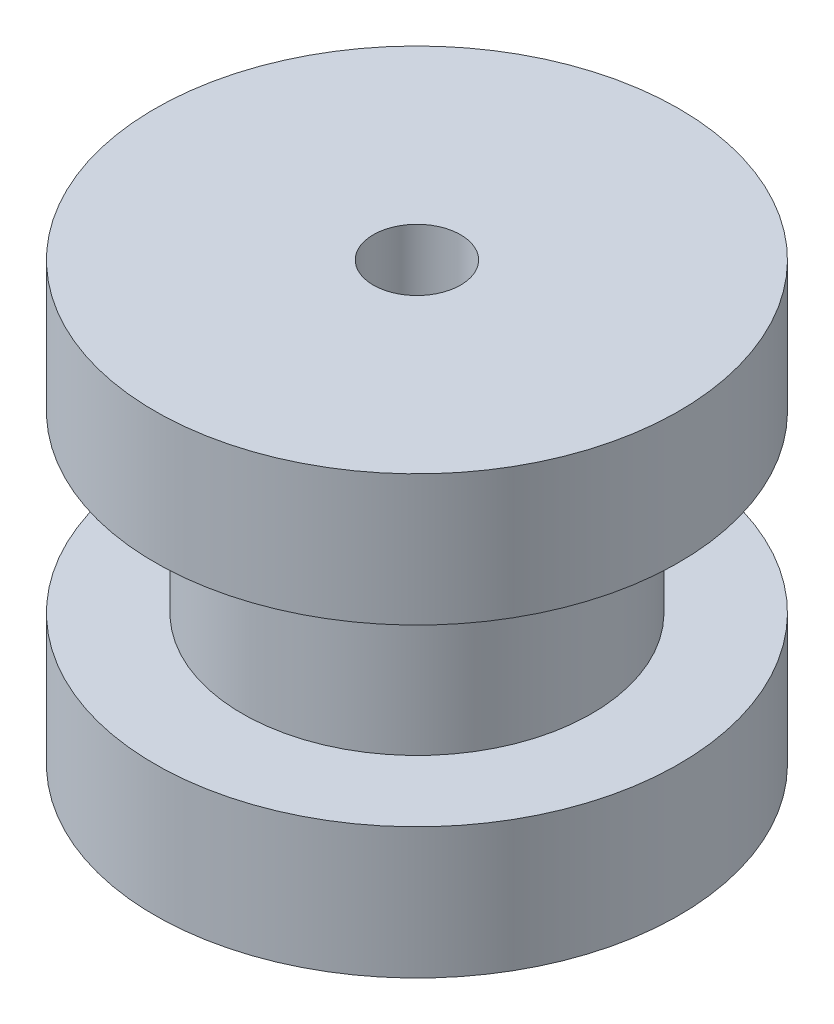
ISO-10303-21;
HEADER;
FILE_DESCRIPTION(('STEP AP214'),'2;1');
FILE_NAME('part.step','',(''),(''),'','','');
FILE_SCHEMA(('AUTOMOTIVE_DESIGN { 1 0 10303 214 1 1 1 1 }'));
ENDSEC;
DATA;
#1=APPLICATION_CONTEXT('core data for automotive mechanical design processes');
#2=APPLICATION_PROTOCOL_DEFINITION('international standard','automotive_design',2000,#1);
#3=PRODUCT_CONTEXT('',#1,'mechanical');
#4=PRODUCT('Part','Part','',(#3));
#5=PRODUCT_RELATED_PRODUCT_CATEGORY('part','',(#4));
#6=PRODUCT_DEFINITION_FORMATION('','',#4);
#7=PRODUCT_DEFINITION_CONTEXT('part definition',#1,'design');
#8=PRODUCT_DEFINITION('design','',#6,#7);
#9=PRODUCT_DEFINITION_SHAPE('','',#8);
#10=(LENGTH_UNIT() NAMED_UNIT(*) SI_UNIT(.MILLI.,.METRE.));
#11=(NAMED_UNIT(*) PLANE_ANGLE_UNIT() SI_UNIT($,.RADIAN.));
#12=(NAMED_UNIT(*) SI_UNIT($,.STERADIAN.) SOLID_ANGLE_UNIT());
#13=UNCERTAINTY_MEASURE_WITH_UNIT(LENGTH_MEASURE(1.E-05),#10,'distance_accuracy_value','');
#14=(GEOMETRIC_REPRESENTATION_CONTEXT(3) GLOBAL_UNCERTAINTY_ASSIGNED_CONTEXT((#13)) GLOBAL_UNIT_ASSIGNED_CONTEXT((#10,
#11,#12)) REPRESENTATION_CONTEXT('',''));
#15=CARTESIAN_POINT('',(0.,0.,0.));
#16=DIRECTION('',(0.,0.,1.));
#17=DIRECTION('',(1.,0.,0.));
#18=AXIS2_PLACEMENT_3D('',#15,#16,#17);
#19=CARTESIAN_POINT('',(6.,-5.,0.));
#20=DIRECTION('',(0.,-1.,0.));
#21=DIRECTION('',(0.,0.,-1.));
#22=AXIS2_PLACEMENT_3D('',#19,#20,#21);
#23=PLANE('',#22);
#24=CARTESIAN_POINT('',(0.,-5.,0.));
#25=DIRECTION('',(0.,-1.,0.));
#26=DIRECTION('',(0.,0.,-1.));
#27=AXIS2_PLACEMENT_3D('',#24,#25,#26);
#28=CIRCLE('',#27,1.);
#29=CARTESIAN_POINT('',(0.,-5.,-1.));
#30=VERTEX_POINT('',#29);
#31=EDGE_CURVE('E67',#30,#30,#28,.T.);
#32=ORIENTED_EDGE('',*,*,#31,.F.);
#33=EDGE_LOOP('',(#32));
#34=FACE_BOUND('',#33,.T.);
#35=CARTESIAN_POINT('',(0.,-5.,0.));
#36=DIRECTION('',(0.,-1.,0.));
#37=DIRECTION('',(0.,0.,-1.));
#38=AXIS2_PLACEMENT_3D('',#35,#36,#37);
#39=CIRCLE('',#38,6.);
#40=CARTESIAN_POINT('',(0.,-5.,-6.));
#41=VERTEX_POINT('',#40);
#42=EDGE_CURVE('E10',#41,#41,#39,.T.);
#43=ORIENTED_EDGE('',*,*,#42,.T.);
#44=EDGE_LOOP('',(#43));
#45=FACE_BOUND('',#44,.T.);
#46=ADVANCED_FACE('F36',(#34,#45),#23,.T.);
#47=CARTESIAN_POINT('',(0.,0.,0.));
#48=DIRECTION('',(0.,-1.,0.));
#49=DIRECTION('',(0.,0.,-1.));
#50=AXIS2_PLACEMENT_3D('',#47,#48,#49);
#51=CYLINDRICAL_SURFACE('',#50,6.);
#52=CARTESIAN_POINT('',(0.,-2.,0.));
#53=DIRECTION('',(0.,-1.,0.));
#54=DIRECTION('',(0.,0.,-1.));
#55=AXIS2_PLACEMENT_3D('',#52,#53,#54);
#56=CIRCLE('',#55,6.);
#57=CARTESIAN_POINT('',(0.,-2.,-6.));
#58=VERTEX_POINT('',#57);
#59=EDGE_CURVE('E44',#58,#58,#56,.T.);
#60=ORIENTED_EDGE('',*,*,#59,.T.);
#61=EDGE_LOOP('',(#60));
#62=FACE_BOUND('',#61,.T.);
#63=ORIENTED_EDGE('',*,*,#42,.F.);
#64=EDGE_LOOP('',(#63));
#65=FACE_BOUND('',#64,.T.);
#66=ADVANCED_FACE('F105',(#62,#65),#51,.T.);
#67=CARTESIAN_POINT('',(4.,-2.,0.));
#68=DIRECTION('',(0.,1.,0.));
#69=DIRECTION('',(0.,0.,1.));
#70=AXIS2_PLACEMENT_3D('',#67,#68,#69);
#71=PLANE('',#70);
#72=CARTESIAN_POINT('',(0.,-2.,0.));
#73=DIRECTION('',(0.,-1.,0.));
#74=DIRECTION('',(0.,0.,-1.));
#75=AXIS2_PLACEMENT_3D('',#72,#73,#74);
#76=CIRCLE('',#75,4.);
#77=CARTESIAN_POINT('',(0.,-2.,-4.));
#78=VERTEX_POINT('',#77);
#79=EDGE_CURVE('E49',#78,#78,#76,.T.);
#80=ORIENTED_EDGE('',*,*,#79,.T.);
#81=EDGE_LOOP('',(#80));
#82=FACE_BOUND('',#81,.T.);
#83=ORIENTED_EDGE('',*,*,#59,.F.);
#84=EDGE_LOOP('',(#83));
#85=FACE_BOUND('',#84,.T.);
#86=ADVANCED_FACE('F99',(#82,#85),#71,.T.);
#87=CARTESIAN_POINT('',(0.,0.,0.));
#88=DIRECTION('',(0.,-1.,0.));
#89=DIRECTION('',(0.,0.,-1.));
#90=AXIS2_PLACEMENT_3D('',#87,#88,#89);
#91=CYLINDRICAL_SURFACE('',#90,4.);
#92=CARTESIAN_POINT('',(0.,2.,0.));
#93=DIRECTION('',(0.,-1.,0.));
#94=DIRECTION('',(0.,0.,-1.));
#95=AXIS2_PLACEMENT_3D('',#92,#93,#94);
#96=CIRCLE('',#95,4.);
#97=CARTESIAN_POINT('',(0.,2.,-4.));
#98=VERTEX_POINT('',#97);
#99=EDGE_CURVE('E55',#98,#98,#96,.T.);
#100=ORIENTED_EDGE('',*,*,#99,.T.);
#101=EDGE_LOOP('',(#100));
#102=FACE_BOUND('',#101,.T.);
#103=ORIENTED_EDGE('',*,*,#79,.F.);
#104=EDGE_LOOP('',(#103));
#105=FACE_BOUND('',#104,.T.);
#106=ADVANCED_FACE('F93',(#102,#105),#91,.T.);
#107=CARTESIAN_POINT('',(6.,2.,0.));
#108=DIRECTION('',(0.,-1.,0.));
#109=DIRECTION('',(0.,0.,-1.));
#110=AXIS2_PLACEMENT_3D('',#107,#108,#109);
#111=PLANE('',#110);
#112=CARTESIAN_POINT('',(0.,2.,0.));
#113=DIRECTION('',(0.,-1.,0.));
#114=DIRECTION('',(0.,0.,-1.));
#115=AXIS2_PLACEMENT_3D('',#112,#113,#114);
#116=CIRCLE('',#115,6.);
#117=CARTESIAN_POINT('',(0.,2.,-6.));
#118=VERTEX_POINT('',#117);
#119=EDGE_CURVE('E59',#118,#118,#116,.T.);
#120=ORIENTED_EDGE('',*,*,#119,.T.);
#121=EDGE_LOOP('',(#120));
#122=FACE_BOUND('',#121,.T.);
#123=ORIENTED_EDGE('',*,*,#99,.F.);
#124=EDGE_LOOP('',(#123));
#125=FACE_BOUND('',#124,.T.);
#126=ADVANCED_FACE('F87',(#122,#125),#111,.T.);
#127=CARTESIAN_POINT('',(0.,0.,0.));
#128=DIRECTION('',(0.,-1.,0.));
#129=DIRECTION('',(0.,0.,-1.));
#130=AXIS2_PLACEMENT_3D('',#127,#128,#129);
#131=CYLINDRICAL_SURFACE('',#130,6.);
#132=CARTESIAN_POINT('',(0.,5.,0.));
#133=DIRECTION('',(0.,-1.,0.));
#134=DIRECTION('',(0.,0.,-1.));
#135=AXIS2_PLACEMENT_3D('',#132,#133,#134);
#136=CIRCLE('',#135,6.);
#137=CARTESIAN_POINT('',(0.,5.,-6.));
#138=VERTEX_POINT('',#137);
#139=EDGE_CURVE('E63',#138,#138,#136,.T.);
#140=ORIENTED_EDGE('',*,*,#139,.T.);
#141=EDGE_LOOP('',(#140));
#142=FACE_BOUND('',#141,.T.);
#143=ORIENTED_EDGE('',*,*,#119,.F.);
#144=EDGE_LOOP('',(#143));
#145=FACE_BOUND('',#144,.T.);
#146=ADVANCED_FACE('F81',(#142,#145),#131,.T.);
#147=CARTESIAN_POINT('',(6.,5.,0.));
#148=DIRECTION('',(0.,1.,0.));
#149=DIRECTION('',(0.,0.,1.));
#150=AXIS2_PLACEMENT_3D('',#147,#148,#149);
#151=PLANE('',#150);
#152=CARTESIAN_POINT('',(0.,5.,0.));
#153=DIRECTION('',(0.,1.,0.));
#154=DIRECTION('',(0.,0.,1.));
#155=AXIS2_PLACEMENT_3D('',#152,#153,#154);
#156=CIRCLE('',#155,1.);
#157=CARTESIAN_POINT('',(0.,5.,1.));
#158=VERTEX_POINT('',#157);
#159=EDGE_CURVE('E39',#158,#158,#156,.T.);
#160=ORIENTED_EDGE('',*,*,#159,.F.);
#161=EDGE_LOOP('',(#160));
#162=FACE_BOUND('',#161,.T.);
#163=ORIENTED_EDGE('',*,*,#139,.F.);
#164=EDGE_LOOP('',(#163));
#165=FACE_BOUND('',#164,.T.);
#166=ADVANCED_FACE('F78',(#162,#165),#151,.T.);
#167=CARTESIAN_POINT('',(0.,-20.,0.));
#168=DIRECTION('',(0.,1.,0.));
#169=DIRECTION('',(0.,0.,1.));
#170=AXIS2_PLACEMENT_3D('',#167,#168,#169);
#171=CYLINDRICAL_SURFACE('',#170,1.);
#172=ORIENTED_EDGE('',*,*,#31,.T.);
#173=EDGE_LOOP('',(#172));
#174=FACE_BOUND('',#173,.T.);
#175=ORIENTED_EDGE('',*,*,#159,.T.);
#176=EDGE_LOOP('',(#175));
#177=FACE_BOUND('',#176,.T.);
#178=ADVANCED_FACE('F76',(#174,#177),#171,.F.);
#179=CLOSED_SHELL('',(#46,#66,#86,#106,#126,#146,#166,#178));
#180=MANIFOLD_SOLID_BREP('B2',#179);
#181=ADVANCED_BREP_SHAPE_REPRESENTATION('',(#18,#180),#14);
#182=SHAPE_DEFINITION_REPRESENTATION(#9,#181);
ENDSEC;
END-ISO-10303-21;
